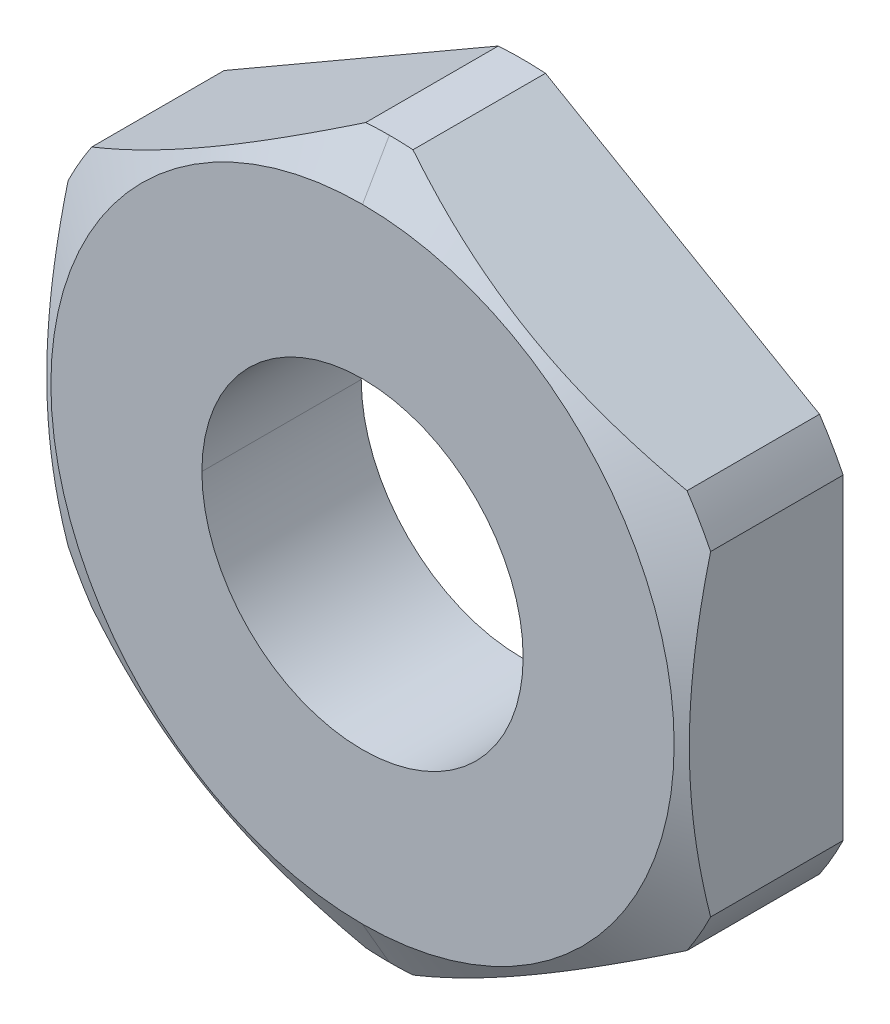
ISO-10303-21;
HEADER;
FILE_DESCRIPTION(('STEP AP214'),'2;1');
FILE_NAME('part.step','',(''),(''),'','','');
FILE_SCHEMA(('AUTOMOTIVE_DESIGN { 1 0 10303 214 1 1 1 1 }'));
ENDSEC;
DATA;
#1=APPLICATION_CONTEXT('core data for automotive mechanical design processes');
#2=APPLICATION_PROTOCOL_DEFINITION('international standard','automotive_design',2000,#1);
#3=PRODUCT_CONTEXT('',#1,'mechanical');
#4=PRODUCT('Part','Part','',(#3));
#5=PRODUCT_RELATED_PRODUCT_CATEGORY('part','',(#4));
#6=PRODUCT_DEFINITION_FORMATION('','',#4);
#7=PRODUCT_DEFINITION_CONTEXT('part definition',#1,'design');
#8=PRODUCT_DEFINITION('design','',#6,#7);
#9=PRODUCT_DEFINITION_SHAPE('','',#8);
#10=(LENGTH_UNIT() NAMED_UNIT(*) SI_UNIT(.MILLI.,.METRE.));
#11=(NAMED_UNIT(*) PLANE_ANGLE_UNIT() SI_UNIT($,.RADIAN.));
#12=(NAMED_UNIT(*) SI_UNIT($,.STERADIAN.) SOLID_ANGLE_UNIT());
#13=UNCERTAINTY_MEASURE_WITH_UNIT(LENGTH_MEASURE(1.E-05),#10,'distance_accuracy_value','');
#14=(GEOMETRIC_REPRESENTATION_CONTEXT(3) GLOBAL_UNCERTAINTY_ASSIGNED_CONTEXT((#13)) GLOBAL_UNIT_ASSIGNED_CONTEXT((#10,
#11,#12)) REPRESENTATION_CONTEXT('',''));
#15=CARTESIAN_POINT('',(0.,0.,0.));
#16=DIRECTION('',(0.,0.,1.));
#17=DIRECTION('',(1.,0.,0.));
#18=AXIS2_PLACEMENT_3D('',#15,#16,#17);
#19=CARTESIAN_POINT('',(3.175,1.83308710467704,7.9248));
#20=DIRECTION('',(0.,0.,-1.));
#21=DIRECTION('',(-1.,0.,0.));
#22=AXIS2_PLACEMENT_3D('',#19,#20,#21);
#23=PLANE('',#22);
#24=CARTESIAN_POINT('',(0.,0.,7.92479999995521));
#25=DIRECTION('',(0.,0.,-1.));
#26=DIRECTION('',(0.,1.,0.));
#27=AXIS2_PLACEMENT_3D('',#24,#25,#26);
#28=CIRCLE('',#27,3.07975000004035);
#29=CARTESIAN_POINT('',(0.,3.07975000004035,7.92479999995521));
#30=VERTEX_POINT('',#29);
#31=CARTESIAN_POINT('',(0.,-3.07975000004035,7.92479999995521));
#32=VERTEX_POINT('',#31);
#33=EDGE_CURVE('E90',#30,#32,#28,.T.);
#34=ORIENTED_EDGE('',*,*,#33,.F.);
#35=CARTESIAN_POINT('',(0.,0.,7.92479999995521));
#36=DIRECTION('',(0.,0.,-1.));
#37=DIRECTION('',(0.,1.,0.));
#38=AXIS2_PLACEMENT_3D('',#35,#36,#37);
#39=CIRCLE('',#38,3.07975000004035);
#40=EDGE_CURVE('E158',#32,#30,#39,.T.);
#41=ORIENTED_EDGE('',*,*,#40,.F.);
#42=EDGE_LOOP('',(#34,#41));
#43=FACE_BOUND('',#42,.T.);
#44=CARTESIAN_POINT('',(0.,0.,7.9248));
#45=DIRECTION('',(0.,0.,1.));
#46=DIRECTION('',(1.,0.,0.));
#47=AXIS2_PLACEMENT_3D('',#44,#45,#46);
#48=CIRCLE('',#47,1.5875);
#49=CARTESIAN_POINT('',(1.5875,0.,7.9248));
#50=VERTEX_POINT('',#49);
#51=CARTESIAN_POINT('',(-1.5875,0.,7.9248));
#52=VERTEX_POINT('',#51);
#53=EDGE_CURVE('E152',#50,#52,#48,.F.);
#54=ORIENTED_EDGE('',*,*,#53,.T.);
#55=CARTESIAN_POINT('',(0.,0.,7.9248));
#56=DIRECTION('',(0.,0.,1.));
#57=DIRECTION('',(1.,0.,0.));
#58=AXIS2_PLACEMENT_3D('',#55,#56,#57);
#59=CIRCLE('',#58,1.5875);
#60=EDGE_CURVE('E344',#52,#50,#59,.F.);
#61=ORIENTED_EDGE('',*,*,#60,.T.);
#62=EDGE_LOOP('',(#54,#61));
#63=FACE_BOUND('',#62,.T.);
#64=ADVANCED_FACE('F17',(#43,#63),#23,.F.);
#65=CARTESIAN_POINT('',(0.,0.,0.));
#66=DIRECTION('',(0.,0.,-1.));
#67=DIRECTION('',(0.,1.,0.));
#68=AXIS2_PLACEMENT_3D('',#65,#66,#67);
#69=CYLINDRICAL_SURFACE('',#68,3.53917420935411);
#70=CARTESIAN_POINT('',(0.,0.,7.6595513090183));
#71=DIRECTION('',(0.,0.,-1.));
#72=DIRECTION('',(0.,1.,0.));
#73=AXIS2_PLACEMENT_3D('',#70,#71,#72);
#74=CIRCLE('',#73,3.53917420937933);
#75=CARTESIAN_POINT('',(3.175,1.56369085317077,7.65955130901764));
#76=VERTEX_POINT('',#75);
#77=CARTESIAN_POINT('',(2.94169600249926,1.96778523043712,7.65955130902118));
#78=VERTEX_POINT('',#77);
#79=EDGE_CURVE('E178',#76,#78,#74,.F.);
#80=ORIENTED_EDGE('',*,*,#79,.F.);
#81=DIRECTION('',(0.,0.,1.));
#82=VECTOR('',#81,1.);
#83=CARTESIAN_POINT('',(3.175,1.56369085315645,7.9248));
#84=LINE('',#83,#82);
#85=CARTESIAN_POINT('',(3.175,1.5636908531424,6.35));
#86=VERTEX_POINT('',#85);
#87=EDGE_CURVE('E88',#76,#86,#84,.F.);
#88=ORIENTED_EDGE('',*,*,#87,.T.);
#89=CARTESIAN_POINT('',(0.,0.,6.35));
#90=DIRECTION('',(0.,0.,-1.));
#91=DIRECTION('',(0.,1.,0.));
#92=AXIS2_PLACEMENT_3D('',#89,#90,#91);
#93=CIRCLE('',#92,3.53917420935411);
#94=CARTESIAN_POINT('',(2.94169600247454,1.96778523045138,6.35));
#95=VERTEX_POINT('',#94);
#96=EDGE_CURVE('E20',#86,#95,#93,.F.);
#97=ORIENTED_EDGE('',*,*,#96,.T.);
#98=DIRECTION('',(0.,0.,1.));
#99=VECTOR('',#98,1.);
#100=CARTESIAN_POINT('',(2.94169600247454,1.96778523045138,7.9248));
#101=LINE('',#100,#99);
#102=EDGE_CURVE('E85',#95,#78,#101,.T.);
#103=ORIENTED_EDGE('',*,*,#102,.T.);
#104=EDGE_LOOP('',(#80,#88,#97,#103));
#105=FACE_BOUND('',#104,.T.);
#106=ADVANCED_FACE('F83',(#105),#69,.T.);
#107=CARTESIAN_POINT('',(0.,0.,7.65955130907514));
#108=DIRECTION('',(0.,0.,-1.));
#109=DIRECTION('',(0.,1.,0.));
#110=AXIS2_PLACEMENT_3D('',#107,#108,#109);
#111=CONICAL_SURFACE('',#110,3.53917420926564,1.04719755117763);
#112=CARTESIAN_POINT('',(2.94169600249895,1.9677852304373,7.65955130901687));
#113=CARTESIAN_POINT('',(2.87374980882137,2.00701398364746,7.67956301120231));
#114=CARTESIAN_POINT('',(2.80555340568453,2.04638719535627,7.69843905887037));
#115=CARTESIAN_POINT('',(2.66864891859604,2.12542903783008,7.73364712685705));
#116=CARTESIAN_POINT('',(2.5999406825502,2.16509775640669,7.74997835656724));
#117=CARTESIAN_POINT('',(2.39292501255059,2.28461830920743,7.79476452280302));
#118=CARTESIAN_POINT('',(2.25389401546777,2.3648878927989,7.81896126615337));
#119=CARTESIAN_POINT('',(1.9775020643092,2.52446286020215,7.85362305563072));
#120=CARTESIAN_POINT('',(1.84016775689509,2.60375285955666,7.86436702728725));
#121=CARTESIAN_POINT('',(1.56530991716852,2.76244210731167,7.8720293390682));
#122=CARTESIAN_POINT('',(1.42778666397795,2.84184119456107,7.86896003682606));
#123=CARTESIAN_POINT('',(1.20202792320193,2.97218306432002,7.85281982091517));
#124=CARTESIAN_POINT('',(1.11356306087684,3.02325827639724,7.84367021514096));
#125=CARTESIAN_POINT('',(0.937135279975905,3.12511890319292,7.82010925278243));
#126=CARTESIAN_POINT('',(0.849172504573495,3.17590423525017,7.80569646472563));
#127=CARTESIAN_POINT('',(0.672745665796731,3.27776431811021,7.77186095289807));
#128=CARTESIAN_POINT('',(0.584291231795857,3.32883350939163,7.75237232889373));
#129=CARTESIAN_POINT('',(0.408180383901573,3.43051115483061,7.70906456544774));
#130=CARTESIAN_POINT('',(0.320523946011295,3.48111962284276,7.68524555668156));
#131=CARTESIAN_POINT('',(0.233303997532796,3.53147608357553,7.65955130902623));
#132=B_SPLINE_CURVE_WITH_KNOTS('',3,(#112,#113,#114,#115,#116,#117,#118,#119,#120,#121,#122,
#123,#124,#125,#126,#127,#128,#129,#130,#131),.UNSPECIFIED.,.F.,.F.,(4,2,2,2,2,2,2,2,2,4),(0.,
0.242893576579854,0.485862464040418,0.972398485874758,1.44867015363036,1.92451582388571,
2.23206438371656,2.53969665252233,2.8515414337254,3.1633768061326),.UNSPECIFIED.);
#133=CARTESIAN_POINT('',(0.233303997530385,3.53147608357692,7.6595513090417));
#134=VERTEX_POINT('',#133);
#135=EDGE_CURVE('E98',#78,#134,#132,.T.);
#136=ORIENTED_EDGE('',*,*,#135,.T.);
#137=CARTESIAN_POINT('',(0.,0.,7.65955130905718));
#138=DIRECTION('',(0.,0.,-1.));
#139=DIRECTION('',(0.,1.,0.));
#140=AXIS2_PLACEMENT_3D('',#137,#138,#139);
#141=CIRCLE('',#140,3.53917420935411);
#142=CARTESIAN_POINT('',(0.,3.53917420933302,7.6595513090502));
#143=VERTEX_POINT('',#142);
#144=EDGE_CURVE('E187',#143,#134,#141,.T.);
#145=ORIENTED_EDGE('',*,*,#144,.F.);
#146=DIRECTION('',(0.,-0.866025403782132,0.500000000003996));
#147=VECTOR('',#146,1.);
#148=CARTESIAN_POINT('',(0.,499000.,-288088.081434202));
#149=LINE('',#148,#147);
#150=EDGE_CURVE('E163',#30,#143,#149,.F.);
#151=ORIENTED_EDGE('',*,*,#150,.F.);
#152=ORIENTED_EDGE('',*,*,#33,.T.);
#153=DIRECTION('',(0.,0.866025403782132,0.500000000003996));
#154=VECTOR('',#153,1.);
#155=CARTESIAN_POINT('',(6.11078570557366E-11,-499000.,-288088.081434202));
#156=LINE('',#155,#154);
#157=CARTESIAN_POINT('',(0.,-3.53917420933302,7.65955130905862));
#158=VERTEX_POINT('',#157);
#159=EDGE_CURVE('E171',#158,#32,#156,.T.);
#160=ORIENTED_EDGE('',*,*,#159,.F.);
#161=CARTESIAN_POINT('',(0.,0.,7.65955130902558));
#162=DIRECTION('',(0.,0.,-1.));
#163=DIRECTION('',(0.,1.,0.));
#164=AXIS2_PLACEMENT_3D('',#161,#162,#163);
#165=CIRCLE('',#164,3.53917420935411);
#166=CARTESIAN_POINT('',(0.233303997525508,-3.53147608357978,7.65955130902482));
#167=VERTEX_POINT('',#166);
#168=EDGE_CURVE('E179',#167,#158,#165,.T.);
#169=ORIENTED_EDGE('',*,*,#168,.F.);
#170=CARTESIAN_POINT('',(0.233303997508421,-3.53147608358964,7.65955130901902));
#171=CARTESIAN_POINT('',(0.301250191185951,-3.49224733037951,7.67956301120436));
#172=CARTESIAN_POINT('',(0.36944659432274,-3.45287411867072,7.69843905887232));
#173=CARTESIAN_POINT('',(0.506351081411133,-3.37383227619697,7.73364712685878));
#174=CARTESIAN_POINT('',(0.575059317456924,-3.33416355762038,7.74997835656886));
#175=CARTESIAN_POINT('',(0.782074987456374,-3.21464300481973,7.79476452280431));
#176=CARTESIAN_POINT('',(0.921105984539085,-3.13437342122833,7.81896126615443));
#177=CARTESIAN_POINT('',(1.19749793569741,-2.97479845382522,7.85362305563132));
#178=CARTESIAN_POINT('',(1.33483224311139,-2.89550845447079,7.86436702728763));
#179=CARTESIAN_POINT('',(1.60969008283767,-2.73681920671594,7.87202933906814));
#180=CARTESIAN_POINT('',(1.74721333602809,-2.65742011946662,7.8689600368258));
#181=CARTESIAN_POINT('',(1.97297207680589,-2.52707824970665,7.85281982091447));
#182=CARTESIAN_POINT('',(2.06143693913291,-2.47600303762832,7.84367021513987));
#183=CARTESIAN_POINT('',(2.23786472003766,-2.37414241083043,7.82010925278037));
#184=CARTESIAN_POINT('',(2.32582749544197,-2.32335707877209,7.80569646472297));
#185=CARTESIAN_POINT('',(2.50225433422254,-2.22149699590985,7.77186095289402));
#186=CARTESIAN_POINT('',(2.59070876822533,-2.17042780462733,7.7523723288889));
#187=CARTESIAN_POINT('',(2.7668196161234,-2.06875015918616,7.70906456544119));
#188=CARTESIAN_POINT('',(2.85447605401555,-2.01814169117293,7.68524555667408));
#189=CARTESIAN_POINT('',(2.9416960024959,-1.96778523043909,7.65955130901776));
#190=B_SPLINE_CURVE_WITH_KNOTS('',3,(#170,#171,#172,#173,#174,#175,#176,#177,#178,#179,#180,
#181,#182,#183,#184,#185,#186,#187,#188,#189),.UNSPECIFIED.,.F.,.F.,(4,2,2,2,2,2,2,2,2,4),(0.,
0.24289357657962,0.48586246403995,0.972398485873806,1.4486701536289,1.92451582388375,
2.23206438372133,2.53969665253385,2.85154143374386,3.16337680615801),.UNSPECIFIED.);
#191=CARTESIAN_POINT('',(2.94169600249737,-1.96778523043825,7.65955130902167));
#192=VERTEX_POINT('',#191);
#193=EDGE_CURVE('E138',#167,#192,#190,.T.);
#194=ORIENTED_EDGE('',*,*,#193,.T.);
#195=CARTESIAN_POINT('',(0.,0.,7.65955130902558));
#196=DIRECTION('',(0.,0.,-1.));
#197=DIRECTION('',(0.,1.,0.));
#198=AXIS2_PLACEMENT_3D('',#195,#196,#197);
#199=CIRCLE('',#198,3.53917420935411);
#200=CARTESIAN_POINT('',(3.175,-1.56369085312837,7.65955130902482));
#201=VERTEX_POINT('',#200);
#202=EDGE_CURVE('E174',#201,#192,#199,.T.);
#203=ORIENTED_EDGE('',*,*,#202,.F.);
#204=CARTESIAN_POINT('',(3.175,-1.5636908531481,7.65955130901903));
#205=CARTESIAN_POINT('',(3.175,-1.48523334672783,7.67956301120437));
#206=CARTESIAN_POINT('',(3.175,-1.40648692331025,7.69843905887232));
#207=CARTESIAN_POINT('',(3.175,-1.24840323836274,7.73364712685878));
#208=CARTESIAN_POINT('',(3.175,-1.16906580120958,7.74997835656887));
#209=CARTESIAN_POINT('',(3.175,-0.930024695608273,7.79476452280432));
#210=CARTESIAN_POINT('',(3.175,-0.769485528425463,7.81896126615443));
#211=CARTESIAN_POINT('',(3.175,-0.450335593619259,7.85362305563132));
#212=CARTESIAN_POINT('',(3.175,-0.291755594910392,7.86436702728764));
#213=CARTESIAN_POINT('',(3.175,0.0256229005993036,7.87202933906815));
#214=CARTESIAN_POINT('',(3.175,0.184421075097938,7.86896003682581));
#215=CARTESIAN_POINT('',(3.175,0.445104814618151,7.85281982091446));
#216=CARTESIAN_POINT('',(3.175,0.54725523877507,7.84367021513984));
#217=CARTESIAN_POINT('',(3.175,0.750976492371367,7.82010925278025));
#218=CARTESIAN_POINT('',(3.175,0.852547156488308,7.80569646472279));
#219=CARTESIAN_POINT('',(3.175,1.0562673222133,7.77186095289371));
#220=CARTESIAN_POINT('',(3.175,1.15840570477862,7.75237232888851));
#221=CARTESIAN_POINT('',(3.175,1.36176099566146,7.70906456544061));
#222=CARTESIAN_POINT('',(3.175,1.46297793168819,7.6852455566734));
#223=CARTESIAN_POINT('',(3.175,1.56369085315611,7.65955130901698));
#224=B_SPLINE_CURVE_WITH_KNOTS('',3,(#204,#205,#206,#207,#208,#209,#210,#211,#212,#213,#214,
#215,#216,#217,#218,#219,#220,#221,#222,#223),.UNSPECIFIED.,.F.,.F.,(4,2,2,2,2,2,2,2,2,4),(0.,
0.242893576579621,0.485862464039952,0.972398485873811,1.4486701536289,1.92451582388374,
2.23206438372211,2.53969665253543,2.85154143374626,3.16337680616121),.UNSPECIFIED.);
#225=EDGE_CURVE('E143',#201,#76,#224,.T.);
#226=ORIENTED_EDGE('',*,*,#225,.T.);
#227=ORIENTED_EDGE('',*,*,#79,.T.);
#228=EDGE_LOOP('',(#136,#145,#151,#152,#160,#169,#194,#203,#226,#227));
#229=FACE_BOUND('',#228,.T.);
#230=ADVANCED_FACE('F268',(#229),#111,.T.);
#231=CARTESIAN_POINT('',(0.,0.,0.));
#232=DIRECTION('',(0.,0.,-1.));
#233=DIRECTION('',(0.,1.,0.));
#234=AXIS2_PLACEMENT_3D('',#231,#232,#233);
#235=CYLINDRICAL_SURFACE('',#234,3.53917420935411);
#236=CARTESIAN_POINT('',(0.,0.,6.35));
#237=DIRECTION('',(0.,0.,-1.));
#238=DIRECTION('',(0.,1.,0.));
#239=AXIS2_PLACEMENT_3D('',#236,#237,#238);
#240=CIRCLE('',#239,3.53917420935411);
#241=CARTESIAN_POINT('',(2.94169600248667,-1.96778523044442,6.35));
#242=VERTEX_POINT('',#241);
#243=CARTESIAN_POINT('',(3.175,-1.56369085312836,6.35));
#244=VERTEX_POINT('',#243);
#245=EDGE_CURVE('E177',#242,#244,#240,.F.);
#246=ORIENTED_EDGE('',*,*,#245,.T.);
#247=DIRECTION('',(0.,0.,1.));
#248=VECTOR('',#247,1.);
#249=CARTESIAN_POINT('',(3.175,-1.56369085312836,7.9248));
#250=LINE('',#249,#248);
#251=EDGE_CURVE('E144',#244,#201,#250,.T.);
#252=ORIENTED_EDGE('',*,*,#251,.T.);
#253=ORIENTED_EDGE('',*,*,#202,.T.);
#254=DIRECTION('',(0.,0.,1.));
#255=VECTOR('',#254,1.);
#256=CARTESIAN_POINT('',(2.94169600249883,-1.9677852304374,7.9248));
#257=LINE('',#256,#255);
#258=EDGE_CURVE('E135',#192,#242,#257,.F.);
#259=ORIENTED_EDGE('',*,*,#258,.T.);
#260=EDGE_LOOP('',(#246,#252,#253,#259));
#261=FACE_BOUND('',#260,.T.);
#262=ADVANCED_FACE('F272',(#261),#235,.T.);
#263=CARTESIAN_POINT('',(0.,0.,0.));
#264=DIRECTION('',(0.,0.,-1.));
#265=DIRECTION('',(0.,1.,0.));
#266=AXIS2_PLACEMENT_3D('',#263,#264,#265);
#267=CYLINDRICAL_SURFACE('',#266,3.53917420935411);
#268=DIRECTION('',(0.,0.,1.));
#269=VECTOR('',#268,1.);
#270=CARTESIAN_POINT('',(0.23330399752551,-3.53147608357978,7.9248));
#271=LINE('',#270,#269);
#272=CARTESIAN_POINT('',(0.233303997525512,-3.53147608357978,6.35));
#273=VERTEX_POINT('',#272);
#274=EDGE_CURVE('E139',#273,#167,#271,.T.);
#275=ORIENTED_EDGE('',*,*,#274,.T.);
#276=ORIENTED_EDGE('',*,*,#168,.T.);
#277=CARTESIAN_POINT('',(0.,0.,7.6595513090183));
#278=DIRECTION('',(0.,0.,-1.));
#279=DIRECTION('',(0.,1.,0.));
#280=AXIS2_PLACEMENT_3D('',#277,#278,#279);
#281=CIRCLE('',#280,3.53917420937933);
#282=CARTESIAN_POINT('',(-0.233303997488776,-3.53147608360098,7.65955130901764));
#283=VERTEX_POINT('',#282);
#284=EDGE_CURVE('E168',#283,#158,#281,.F.);
#285=ORIENTED_EDGE('',*,*,#284,.F.);
#286=DIRECTION('',(0.,0.,1.));
#287=VECTOR('',#286,1.);
#288=CARTESIAN_POINT('',(-0.233303997501179,-3.53147608359382,7.9248));
#289=LINE('',#288,#287);
#290=CARTESIAN_POINT('',(-0.233303997513344,-3.53147608358679,6.35));
#291=VERTEX_POINT('',#290);
#292=EDGE_CURVE('E128',#283,#291,#289,.F.);
#293=ORIENTED_EDGE('',*,*,#292,.T.);
#294=CARTESIAN_POINT('',(0.,0.,6.35));
#295=DIRECTION('',(0.,0.,-1.));
#296=DIRECTION('',(0.,1.,0.));
#297=AXIS2_PLACEMENT_3D('',#294,#295,#296);
#298=CIRCLE('',#297,3.53917420935411);
#299=EDGE_CURVE('E183',#291,#273,#298,.F.);
#300=ORIENTED_EDGE('',*,*,#299,.T.);
#301=EDGE_LOOP('',(#275,#276,#285,#293,#300));
#302=FACE_BOUND('',#301,.T.);
#303=ADVANCED_FACE('F368',(#302),#267,.T.);
#304=CARTESIAN_POINT('',(0.,0.,0.));
#305=DIRECTION('',(0.,0.,-1.));
#306=DIRECTION('',(0.,1.,0.));
#307=AXIS2_PLACEMENT_3D('',#304,#305,#306);
#308=CYLINDRICAL_SURFACE('',#307,3.53917420935411);
#309=CARTESIAN_POINT('',(0.,0.,6.35));
#310=DIRECTION('',(0.,0.,-1.));
#311=DIRECTION('',(0.,1.,0.));
#312=AXIS2_PLACEMENT_3D('',#309,#310,#311);
#313=CIRCLE('',#312,3.53917420935411);
#314=CARTESIAN_POINT('',(-3.175,-1.56369085314241,6.35));
#315=VERTEX_POINT('',#314);
#316=CARTESIAN_POINT('',(-2.9416960024745,-1.96778523045144,6.35));
#317=VERTEX_POINT('',#316);
#318=EDGE_CURVE('E182',#315,#317,#313,.F.);
#319=ORIENTED_EDGE('',*,*,#318,.T.);
#320=DIRECTION('',(0.,0.,1.));
#321=VECTOR('',#320,1.);
#322=CARTESIAN_POINT('',(-2.9416960024745,-1.96778523045144,7.9248));
#323=LINE('',#322,#321);
#324=CARTESIAN_POINT('',(-2.94169600249921,-1.96778523043717,7.65955130902118));
#325=VERTEX_POINT('',#324);
#326=EDGE_CURVE('E132',#317,#325,#323,.T.);
#327=ORIENTED_EDGE('',*,*,#326,.T.);
#328=CARTESIAN_POINT('',(0.,0.,7.6595513090183));
#329=DIRECTION('',(0.,0.,-1.));
#330=DIRECTION('',(0.,1.,0.));
#331=AXIS2_PLACEMENT_3D('',#328,#329,#330);
#332=CIRCLE('',#331,3.53917420937933);
#333=CARTESIAN_POINT('',(-3.175,-1.56369085317078,7.65955130901764));
#334=VERTEX_POINT('',#333);
#335=EDGE_CURVE('E162',#334,#325,#332,.F.);
#336=ORIENTED_EDGE('',*,*,#335,.F.);
#337=DIRECTION('',(0.,0.,1.));
#338=VECTOR('',#337,1.);
#339=CARTESIAN_POINT('',(-3.175,-1.56369085315645,7.9248));
#340=LINE('',#339,#338);
#341=EDGE_CURVE('E121',#334,#315,#340,.F.);
#342=ORIENTED_EDGE('',*,*,#341,.T.);
#343=EDGE_LOOP('',(#319,#327,#336,#342));
#344=FACE_BOUND('',#343,.T.);
#345=ADVANCED_FACE('F383',(#344),#308,.T.);
#346=CARTESIAN_POINT('',(0.,0.,0.));
#347=DIRECTION('',(0.,0.,-1.));
#348=DIRECTION('',(0.,1.,0.));
#349=AXIS2_PLACEMENT_3D('',#346,#347,#348);
#350=CYLINDRICAL_SURFACE('',#349,3.53917420935411);
#351=CARTESIAN_POINT('',(0.,0.,6.35));
#352=DIRECTION('',(0.,0.,-1.));
#353=DIRECTION('',(0.,1.,0.));
#354=AXIS2_PLACEMENT_3D('',#351,#352,#353);
#355=CIRCLE('',#354,3.53917420935411);
#356=CARTESIAN_POINT('',(0.233303997526709,3.53147608357905,6.35));
#357=VERTEX_POINT('',#356);
#358=CARTESIAN_POINT('',(-0.233303997525445,3.53147608357978,6.35));
#359=VERTEX_POINT('',#358);
#360=EDGE_CURVE('E103',#357,#359,#355,.F.);
#361=ORIENTED_EDGE('',*,*,#360,.T.);
#362=DIRECTION('',(0.,0.,1.));
#363=VECTOR('',#362,1.);
#364=CARTESIAN_POINT('',(-0.233303997525443,3.53147608357978,7.9248));
#365=LINE('',#364,#363);
#366=CARTESIAN_POINT('',(-0.233303997500732,3.53147608359405,7.65955130902118));
#367=VERTEX_POINT('',#366);
#368=EDGE_CURVE('E118',#359,#367,#365,.T.);
#369=ORIENTED_EDGE('',*,*,#368,.T.);
#370=CARTESIAN_POINT('',(0.,0.,7.6595513090183));
#371=DIRECTION('',(0.,0.,-1.));
#372=DIRECTION('',(0.,1.,0.));
#373=AXIS2_PLACEMENT_3D('',#370,#371,#372);
#374=CIRCLE('',#373,3.53917420937933);
#375=EDGE_CURVE('E159',#143,#367,#374,.F.);
#376=ORIENTED_EDGE('',*,*,#375,.F.);
#377=ORIENTED_EDGE('',*,*,#144,.T.);
#378=DIRECTION('',(0.,0.,1.));
#379=VECTOR('',#378,1.);
#380=CARTESIAN_POINT('',(0.233303997527974,3.53147608357832,7.9248));
#381=LINE('',#380,#379);
#382=EDGE_CURVE('E147',#134,#357,#381,.F.);
#383=ORIENTED_EDGE('',*,*,#382,.T.);
#384=EDGE_LOOP('',(#361,#369,#376,#377,#383));
#385=FACE_BOUND('',#384,.T.);
#386=ADVANCED_FACE('F223',(#385),#350,.T.);
#387=CARTESIAN_POINT('',(0.,0.,7.65955130907514));
#388=DIRECTION('',(0.,0.,-1.));
#389=DIRECTION('',(0.,1.,0.));
#390=AXIS2_PLACEMENT_3D('',#387,#388,#389);
#391=CONICAL_SURFACE('',#390,3.53917420926564,1.04719755117763);
#392=ORIENTED_EDGE('',*,*,#159,.T.);
#393=ORIENTED_EDGE('',*,*,#40,.T.);
#394=ORIENTED_EDGE('',*,*,#150,.T.);
#395=ORIENTED_EDGE('',*,*,#375,.T.);
#396=CARTESIAN_POINT('',(-0.233303997526132,3.53147608357938,7.65955130902426));
#397=CARTESIAN_POINT('',(-0.30125019120353,3.49224733036932,7.67956301120935));
#398=CARTESIAN_POINT('',(-0.369446594340184,3.45287411866061,7.69843905887705));
#399=CARTESIAN_POINT('',(-0.506351081428303,3.37383227618702,7.73364712686299));
#400=CARTESIAN_POINT('',(-0.575059317473954,3.33416355761052,7.74997835657281));
#401=CARTESIAN_POINT('',(-0.782074987472968,3.21464300481012,7.79476452280744));
#402=CARTESIAN_POINT('',(-0.921105984555372,3.13437342121889,7.818961266157));
#403=CARTESIAN_POINT('',(-1.1974979357131,2.97479845381613,7.8536230556328));
#404=CARTESIAN_POINT('',(-1.33483224312679,2.89550845446186,7.86436702728858));
#405=CARTESIAN_POINT('',(-1.60969008285246,2.73681920670737,7.87202933906807));
#406=CARTESIAN_POINT('',(-1.74721333604254,2.65742011945823,7.86896003682524));
#407=CARTESIAN_POINT('',(-1.97297207681646,2.5270782497005,7.85281982091342));
#408=CARTESIAN_POINT('',(-2.06143693913995,2.47600303762422,7.84367021513902));
#409=CARTESIAN_POINT('',(-2.23786472003766,2.3741424108304,7.82010925278031));
#410=CARTESIAN_POINT('',(-2.32582749543846,2.32335707877408,7.80569646472353));
#411=CARTESIAN_POINT('',(-2.50225433421198,2.22149699591591,7.7718609528962));
#412=CARTESIAN_POINT('',(-2.59070876821121,2.17042780463544,7.75237232889209));
#413=CARTESIAN_POINT('',(-2.76681961610225,2.06875015919834,7.7090645654467));
#414=CARTESIAN_POINT('',(-2.85447605399092,2.01814169118711,7.68524555668092));
#415=CARTESIAN_POINT('',(-2.94169600246782,1.96778523045527,7.65955130902605));
#416=B_SPLINE_CURVE_WITH_KNOTS('',3,(#396,#397,#398,#399,#400,#401,#402,#403,#404,#405,#406,
#407,#408,#409,#410,#411,#412,#413,#414,#415),.UNSPECIFIED.,.F.,.F.,(4,2,2,2,2,2,2,2,2,4),(0.,
0.242893576578987,0.485862464038683,0.972398485871238,1.44867015362522,1.92451582387897,
2.23206438370432,2.53969665250458,2.85154143370195,3.16337680610345),.UNSPECIFIED.);
#417=CARTESIAN_POINT('',(-2.94169600246992,1.96778523045406,7.65955130903553));
#418=VERTEX_POINT('',#417);
#419=EDGE_CURVE('E117',#367,#418,#416,.T.);
#420=ORIENTED_EDGE('',*,*,#419,.T.);
#421=CARTESIAN_POINT('',(0.,0.,7.65955130904501));
#422=DIRECTION('',(0.,0.,-1.));
#423=DIRECTION('',(0.,1.,0.));
#424=AXIS2_PLACEMENT_3D('',#421,#422,#423);
#425=CIRCLE('',#424,3.53917420935411);
#426=CARTESIAN_POINT('',(-3.175,1.56369085312837,7.65955130903454));
#427=VERTEX_POINT('',#426);
#428=EDGE_CURVE('E155',#427,#418,#425,.T.);
#429=ORIENTED_EDGE('',*,*,#428,.F.);
#430=CARTESIAN_POINT('',(-3.175,1.56369085312335,7.65955130902534));
#431=CARTESIAN_POINT('',(-3.175,1.48523334670326,7.67956301121038));
#432=CARTESIAN_POINT('',(-3.175,1.40648692328586,7.69843905887802));
#433=CARTESIAN_POINT('',(-3.175,1.24840323833872,7.73364712686386));
#434=CARTESIAN_POINT('',(-3.175,1.16906580118575,7.74997835657362));
#435=CARTESIAN_POINT('',(-3.175,0.930024695585025,7.79476452280809));
#436=CARTESIAN_POINT('',(-3.175,0.769485528402625,7.81896126615754));
#437=CARTESIAN_POINT('',(-3.175,0.450335593597251,7.8536230556331));
#438=CARTESIAN_POINT('',(-3.175,0.291755594888802,7.86436702728876));
#439=CARTESIAN_POINT('',(-3.175,-0.0256229006200072,7.87202933906805));
#440=CARTESIAN_POINT('',(-3.175,-0.184421075118173,7.86896003682512));
#441=CARTESIAN_POINT('',(-3.175,-0.445104814636258,7.85281982091298));
#442=CARTESIAN_POINT('',(-3.175,-0.547255238791534,7.84367021513819));
#443=CARTESIAN_POINT('',(-3.175,-0.750976492384552,7.82010925277846));
#444=CARTESIAN_POINT('',(-3.175,-0.852547156499857,7.80569646472104));
#445=CARTESIAN_POINT('',(-3.175,-1.05626732222155,7.77186095289218));
#446=CARTESIAN_POINT('',(-3.175,-1.15840570478519,7.75237232888718));
#447=CARTESIAN_POINT('',(-3.175,-1.36176099566473,7.70906456543984));
#448=CARTESIAN_POINT('',(-3.175,-1.46297793168982,7.68524555667299));
#449=CARTESIAN_POINT('',(-3.175,-1.56369085315612,7.65955130901698));
#450=B_SPLINE_CURVE_WITH_KNOTS('',3,(#430,#431,#432,#433,#434,#435,#436,#437,#438,#439,#440,
#441,#442,#443,#444,#445,#446,#447,#448,#449),.UNSPECIFIED.,.F.,.F.,(4,2,2,2,2,2,2,2,2,4),(0.,
0.24289357657888,0.485862464038469,0.972398485870804,1.44867015362451,1.92451582387799,
2.2320643837115,2.53969665251995,2.85154143372576,3.16337680613569),.UNSPECIFIED.);
#451=EDGE_CURVE('E124',#427,#334,#450,.T.);
#452=ORIENTED_EDGE('',*,*,#451,.T.);
#453=ORIENTED_EDGE('',*,*,#335,.T.);
#454=CARTESIAN_POINT('',(-2.94169600249891,-1.96778523043735,7.65955130901687));
#455=CARTESIAN_POINT('',(-2.87374980882132,-2.00701398364752,7.67956301120231));
#456=CARTESIAN_POINT('',(-2.80555340568448,-2.04638719535634,7.69843905887037));
#457=CARTESIAN_POINT('',(-2.66864891859598,-2.12542903783015,7.73364712685705));
#458=CARTESIAN_POINT('',(-2.59994068255013,-2.16509775640676,7.74997835656724));
#459=CARTESIAN_POINT('',(-2.39292501255051,-2.28461830920752,7.79476452280302));
#460=CARTESIAN_POINT('',(-2.25389401546767,-2.36488789279899,7.81896126615337));
#461=CARTESIAN_POINT('',(-1.97750206430911,-2.52446286020224,7.85362305563071));
#462=CARTESIAN_POINT('',(-1.840167756895,-2.60375285955674,7.86436702728724));
#463=CARTESIAN_POINT('',(-1.56530991716846,-2.76244210731174,7.87202933906818));
#464=CARTESIAN_POINT('',(-1.42778666397791,-2.84184119456114,7.86896003682604));
#465=CARTESIAN_POINT('',(-1.20202792319925,-2.97218306432161,7.85281982091496));
#466=CARTESIAN_POINT('',(-1.11356306087152,-3.02325827640034,7.84367021514039));
#467=CARTESIAN_POINT('',(-0.937135279965356,-3.12511890319905,7.82010925278084));
#468=CARTESIAN_POINT('',(-0.849172504560349,-3.1759042352578,7.80569646472338));
#469=CARTESIAN_POINT('',(-0.672745665778356,-3.27776431812085,7.77186095289422));
#470=CARTESIAN_POINT('',(-0.584291231774854,-3.32883350940379,7.75237232888895));
#471=CARTESIAN_POINT('',(-0.408180383875368,-3.43051115484577,7.70906456544087));
#472=CARTESIAN_POINT('',(-0.320523945982515,-3.48111962285941,7.68524555667354));
#473=CARTESIAN_POINT('',(-0.23330399750147,-3.53147608359365,7.65955130901698));
#474=B_SPLINE_CURVE_WITH_KNOTS('',3,(#454,#455,#456,#457,#458,#459,#460,#461,#462,#463,#464,
#465,#466,#467,#468,#469,#470,#471,#472,#473),.UNSPECIFIED.,.F.,.F.,(4,2,2,2,2,2,2,2,2,4),(0.,
0.242893576579874,0.485862464040459,0.972398485874839,1.4486701536304,1.92451582388571,
2.23206438372572,2.53969665254068,2.85154143375321,3.16337680616987),.UNSPECIFIED.);
#475=EDGE_CURVE('E131',#325,#283,#474,.T.);
#476=ORIENTED_EDGE('',*,*,#475,.T.);
#477=ORIENTED_EDGE('',*,*,#284,.T.);
#478=EDGE_LOOP('',(#392,#393,#394,#395,#420,#429,#452,#453,#476,#477));
#479=FACE_BOUND('',#478,.T.);
#480=ADVANCED_FACE('F217',(#479),#391,.T.);
#481=CARTESIAN_POINT('',(0.,0.,0.));
#482=DIRECTION('',(0.,0.,-1.));
#483=DIRECTION('',(0.,1.,0.));
#484=AXIS2_PLACEMENT_3D('',#481,#482,#483);
#485=CYLINDRICAL_SURFACE('',#484,3.53917420935411);
#486=CARTESIAN_POINT('',(0.,0.,6.35));
#487=DIRECTION('',(0.,0.,-1.));
#488=DIRECTION('',(0.,1.,0.));
#489=AXIS2_PLACEMENT_3D('',#486,#487,#488);
#490=CIRCLE('',#489,3.53917420935411);
#491=CARTESIAN_POINT('',(-2.94169600247328,1.96778523045212,6.35));
#492=VERTEX_POINT('',#491);
#493=CARTESIAN_POINT('',(-3.175,1.56369085312837,6.35));
#494=VERTEX_POINT('',#493);
#495=EDGE_CURVE('E34',#492,#494,#490,.F.);
#496=ORIENTED_EDGE('',*,*,#495,.T.);
#497=DIRECTION('',(0.,0.,1.));
#498=VECTOR('',#497,1.);
#499=CARTESIAN_POINT('',(-3.175,1.56369085312837,7.9248));
#500=LINE('',#499,#498);
#501=EDGE_CURVE('E125',#494,#427,#500,.T.);
#502=ORIENTED_EDGE('',*,*,#501,.T.);
#503=ORIENTED_EDGE('',*,*,#428,.T.);
#504=DIRECTION('',(0.,0.,1.));
#505=VECTOR('',#504,1.);
#506=CARTESIAN_POINT('',(-2.94169600247201,1.96778523045284,7.9248));
#507=LINE('',#506,#505);
#508=EDGE_CURVE('E115',#418,#492,#507,.F.);
#509=ORIENTED_EDGE('',*,*,#508,.T.);
#510=EDGE_LOOP('',(#496,#502,#503,#509));
#511=FACE_BOUND('',#510,.T.);
#512=ADVANCED_FACE('F222',(#511),#485,.T.);
#513=CARTESIAN_POINT('',(0.,0.,6.35));
#514=DIRECTION('',(0.,0.,1.));
#515=DIRECTION('',(1.,0.,0.));
#516=AXIS2_PLACEMENT_3D('',#513,#514,#515);
#517=CYLINDRICAL_SURFACE('',#516,1.5875);
#518=ORIENTED_EDGE('',*,*,#60,.F.);
#519=DIRECTION('',(0.,0.,1.));
#520=VECTOR('',#519,1.);
#521=CARTESIAN_POINT('',(-1.5875,0.,6.35));
#522=LINE('',#521,#520);
#523=CARTESIAN_POINT('',(-1.5875,0.,6.35));
#524=VERTEX_POINT('',#523);
#525=EDGE_CURVE('E149',#52,#524,#522,.F.);
#526=ORIENTED_EDGE('',*,*,#525,.T.);
#527=CARTESIAN_POINT('',(0.,0.,6.35));
#528=DIRECTION('',(0.,0.,1.));
#529=DIRECTION('',(1.,0.,0.));
#530=AXIS2_PLACEMENT_3D('',#527,#528,#529);
#531=CIRCLE('',#530,1.5875);
#532=CARTESIAN_POINT('',(1.5875,0.,6.35));
#533=VERTEX_POINT('',#532);
#534=EDGE_CURVE('E111',#533,#524,#531,.T.);
#535=ORIENTED_EDGE('',*,*,#534,.F.);
#536=DIRECTION('',(0.,0.,1.));
#537=VECTOR('',#536,1.);
#538=CARTESIAN_POINT('',(1.5875,0.,6.35));
#539=LINE('',#538,#537);
#540=EDGE_CURVE('E99',#533,#50,#539,.T.);
#541=ORIENTED_EDGE('',*,*,#540,.T.);
#542=EDGE_LOOP('',(#518,#526,#535,#541));
#543=FACE_BOUND('',#542,.T.);
#544=ADVANCED_FACE('F350',(#543),#517,.F.);
#545=CARTESIAN_POINT('',(0.,0.,6.35));
#546=DIRECTION('',(0.,0.,1.));
#547=DIRECTION('',(1.,0.,0.));
#548=AXIS2_PLACEMENT_3D('',#545,#546,#547);
#549=CYLINDRICAL_SURFACE('',#548,1.5875);
#550=CARTESIAN_POINT('',(0.,0.,6.35));
#551=DIRECTION('',(0.,0.,1.));
#552=DIRECTION('',(1.,0.,0.));
#553=AXIS2_PLACEMENT_3D('',#550,#551,#552);
#554=CIRCLE('',#553,1.5875);
#555=EDGE_CURVE('E106',#524,#533,#554,.T.);
#556=ORIENTED_EDGE('',*,*,#555,.F.);
#557=ORIENTED_EDGE('',*,*,#525,.F.);
#558=ORIENTED_EDGE('',*,*,#53,.F.);
#559=ORIENTED_EDGE('',*,*,#540,.F.);
#560=EDGE_LOOP('',(#556,#557,#558,#559));
#561=FACE_BOUND('',#560,.T.);
#562=ADVANCED_FACE('F353',(#561),#549,.F.);
#563=CARTESIAN_POINT('',(3.175,1.83308710467704,7.9248));
#564=DIRECTION('',(-0.5,-0.866025403784439,0.));
#565=DIRECTION('',(0.866025403784439,-0.5,0.));
#566=AXIS2_PLACEMENT_3D('',#563,#564,#565);
#567=PLANE('',#566);
#568=ORIENTED_EDGE('',*,*,#135,.F.);
#569=ORIENTED_EDGE('',*,*,#102,.F.);
#570=DIRECTION('',(0.866025403784439,-0.5,0.));
#571=VECTOR('',#570,1.);
#572=CARTESIAN_POINT('',(0.233303997525452,3.53147608357978,6.35));
#573=LINE('',#572,#571);
#574=EDGE_CURVE('E96',#357,#95,#573,.T.);
#575=ORIENTED_EDGE('',*,*,#574,.F.);
#576=ORIENTED_EDGE('',*,*,#382,.F.);
#577=EDGE_LOOP('',(#568,#569,#575,#576));
#578=FACE_BOUND('',#577,.T.);
#579=ADVANCED_FACE('F94',(#578),#567,.F.);
#580=CARTESIAN_POINT('',(3.175,-1.83308710467708,7.9248));
#581=DIRECTION('',(-1.,0.,0.));
#582=DIRECTION('',(0.,0.,1.));
#583=AXIS2_PLACEMENT_3D('',#580,#581,#582);
#584=PLANE('',#583);
#585=ORIENTED_EDGE('',*,*,#225,.F.);
#586=ORIENTED_EDGE('',*,*,#251,.F.);
#587=DIRECTION('',(0.,1.,0.));
#588=VECTOR('',#587,1.);
#589=CARTESIAN_POINT('',(3.175,1.83308710467704,6.35));
#590=LINE('',#589,#588);
#591=EDGE_CURVE('E105',#86,#244,#590,.F.);
#592=ORIENTED_EDGE('',*,*,#591,.F.);
#593=ORIENTED_EDGE('',*,*,#87,.F.);
#594=EDGE_LOOP('',(#585,#586,#592,#593));
#595=FACE_BOUND('',#594,.T.);
#596=ADVANCED_FACE('F251',(#595),#584,.F.);
#597=CARTESIAN_POINT('',(0.,-3.66617420935414,7.9248));
#598=DIRECTION('',(-0.5,0.866025403784439,0.));
#599=DIRECTION('',(-0.866025403784439,-0.5,0.));
#600=AXIS2_PLACEMENT_3D('',#597,#598,#599);
#601=PLANE('',#600);
#602=ORIENTED_EDGE('',*,*,#193,.F.);
#603=ORIENTED_EDGE('',*,*,#274,.F.);
#604=DIRECTION('',(-0.866025403784439,-0.5,0.));
#605=VECTOR('',#604,1.);
#606=CARTESIAN_POINT('',(2.9416960024745,-1.96778523045145,6.35));
#607=LINE('',#606,#605);
#608=EDGE_CURVE('E108',#242,#273,#607,.T.);
#609=ORIENTED_EDGE('',*,*,#608,.F.);
#610=ORIENTED_EDGE('',*,*,#258,.F.);
#611=EDGE_LOOP('',(#602,#603,#609,#610));
#612=FACE_BOUND('',#611,.T.);
#613=ADVANCED_FACE('F245',(#612),#601,.F.);
#614=CARTESIAN_POINT('',(-3.175,-1.83308710467708,7.9248));
#615=DIRECTION('',(0.5,0.866025403784439,0.));
#616=DIRECTION('',(-0.866025403784439,0.5,0.));
#617=AXIS2_PLACEMENT_3D('',#614,#615,#616);
#618=PLANE('',#617);
#619=ORIENTED_EDGE('',*,*,#475,.F.);
#620=ORIENTED_EDGE('',*,*,#326,.F.);
#621=DIRECTION('',(-0.866025403784439,0.5,0.));
#622=VECTOR('',#621,1.);
#623=CARTESIAN_POINT('',(-0.233303997525517,-3.53147608357977,6.35));
#624=LINE('',#623,#622);
#625=EDGE_CURVE('E378',#291,#317,#624,.T.);
#626=ORIENTED_EDGE('',*,*,#625,.F.);
#627=ORIENTED_EDGE('',*,*,#292,.F.);
#628=EDGE_LOOP('',(#619,#620,#626,#627));
#629=FACE_BOUND('',#628,.T.);
#630=ADVANCED_FACE('F241',(#629),#618,.F.);
#631=CARTESIAN_POINT('',(-3.175,1.83308710467704,7.9248));
#632=DIRECTION('',(1.,0.,0.));
#633=DIRECTION('',(0.,1.,0.));
#634=AXIS2_PLACEMENT_3D('',#631,#632,#633);
#635=PLANE('',#634);
#636=ORIENTED_EDGE('',*,*,#451,.F.);
#637=ORIENTED_EDGE('',*,*,#501,.F.);
#638=DIRECTION('',(0.,1.,0.));
#639=VECTOR('',#638,1.);
#640=CARTESIAN_POINT('',(-3.175,1.83308710467704,6.35));
#641=LINE('',#640,#639);
#642=EDGE_CURVE('E26',#315,#494,#641,.T.);
#643=ORIENTED_EDGE('',*,*,#642,.F.);
#644=ORIENTED_EDGE('',*,*,#341,.F.);
#645=EDGE_LOOP('',(#636,#637,#643,#644));
#646=FACE_BOUND('',#645,.T.);
#647=ADVANCED_FACE('F244',(#646),#635,.F.);
#648=CARTESIAN_POINT('',(0.,3.6661742093541,7.9248));
#649=DIRECTION('',(0.5,-0.866025403784439,0.));
#650=DIRECTION('',(0.866025403784439,0.5,0.));
#651=AXIS2_PLACEMENT_3D('',#648,#649,#650);
#652=PLANE('',#651);
#653=ORIENTED_EDGE('',*,*,#419,.F.);
#654=ORIENTED_EDGE('',*,*,#368,.F.);
#655=DIRECTION('',(0.866025403784439,0.5,0.));
#656=VECTOR('',#655,1.);
#657=CARTESIAN_POINT('',(-2.94169600247454,1.96778523045139,6.35));
#658=LINE('',#657,#656);
#659=EDGE_CURVE('E11',#492,#359,#658,.T.);
#660=ORIENTED_EDGE('',*,*,#659,.F.);
#661=ORIENTED_EDGE('',*,*,#508,.F.);
#662=EDGE_LOOP('',(#653,#654,#660,#661));
#663=FACE_BOUND('',#662,.T.);
#664=ADVANCED_FACE('F214',(#663),#652,.F.);
#665=CARTESIAN_POINT('',(3.175,1.83308710467704,6.35));
#666=DIRECTION('',(0.,0.,-1.));
#667=DIRECTION('',(-1.,0.,0.));
#668=AXIS2_PLACEMENT_3D('',#665,#666,#667);
#669=PLANE('',#668);
#670=ORIENTED_EDGE('',*,*,#495,.F.);
#671=ORIENTED_EDGE('',*,*,#659,.T.);
#672=ORIENTED_EDGE('',*,*,#360,.F.);
#673=ORIENTED_EDGE('',*,*,#574,.T.);
#674=ORIENTED_EDGE('',*,*,#96,.F.);
#675=ORIENTED_EDGE('',*,*,#591,.T.);
#676=ORIENTED_EDGE('',*,*,#245,.F.);
#677=ORIENTED_EDGE('',*,*,#608,.T.);
#678=ORIENTED_EDGE('',*,*,#299,.F.);
#679=ORIENTED_EDGE('',*,*,#625,.T.);
#680=ORIENTED_EDGE('',*,*,#318,.F.);
#681=ORIENTED_EDGE('',*,*,#642,.T.);
#682=EDGE_LOOP('',(#670,#671,#672,#673,#674,#675,#676,#677,#678,#679,#680,#681));
#683=FACE_BOUND('',#682,.T.);
#684=ORIENTED_EDGE('',*,*,#534,.T.);
#685=ORIENTED_EDGE('',*,*,#555,.T.);
#686=EDGE_LOOP('',(#684,#685));
#687=FACE_BOUND('',#686,.T.);
#688=ADVANCED_FACE('F101',(#683,#687),#669,.T.);
#689=CLOSED_SHELL('',(#64,#106,#230,#262,#303,#345,#386,#480,#512,#544,#562,#579,#596,#613,#630,
#647,#664,#688));
#690=MANIFOLD_SOLID_BREP('B1',#689);
#691=ADVANCED_BREP_SHAPE_REPRESENTATION('',(#18,#690),#14);
#692=SHAPE_DEFINITION_REPRESENTATION(#9,#691);
ENDSEC;
END-ISO-10303-21;
